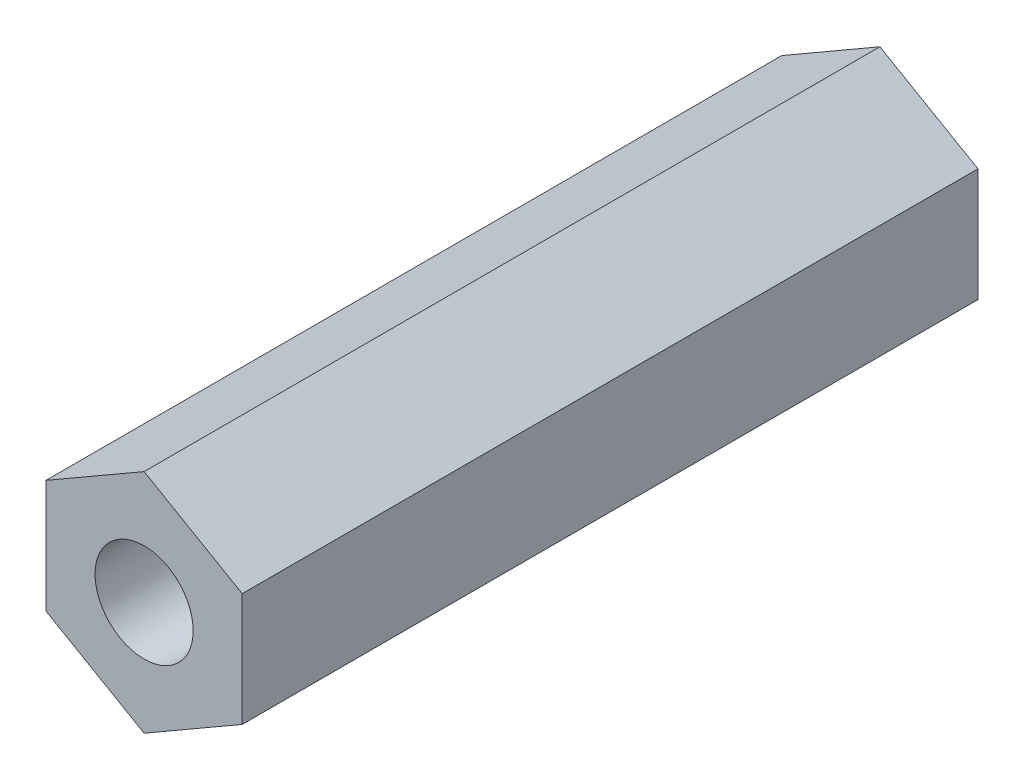
ISO-10303-21;
HEADER;
FILE_DESCRIPTION(('STEP AP214'),'2;1');
FILE_NAME('part.step','',(''),(''),'','','');
FILE_SCHEMA(('AUTOMOTIVE_DESIGN { 1 0 10303 214 1 1 1 1 }'));
ENDSEC;
DATA;
#1=APPLICATION_CONTEXT('core data for automotive mechanical design processes');
#2=APPLICATION_PROTOCOL_DEFINITION('international standard','automotive_design',2000,#1);
#3=PRODUCT_CONTEXT('',#1,'mechanical');
#4=PRODUCT('Part','Part','',(#3));
#5=PRODUCT_RELATED_PRODUCT_CATEGORY('part','',(#4));
#6=PRODUCT_DEFINITION_FORMATION('','',#4);
#7=PRODUCT_DEFINITION_CONTEXT('part definition',#1,'design');
#8=PRODUCT_DEFINITION('design','',#6,#7);
#9=PRODUCT_DEFINITION_SHAPE('','',#8);
#10=(LENGTH_UNIT() NAMED_UNIT(*) SI_UNIT(.MILLI.,.METRE.));
#11=(NAMED_UNIT(*) PLANE_ANGLE_UNIT() SI_UNIT($,.RADIAN.));
#12=(NAMED_UNIT(*) SI_UNIT($,.STERADIAN.) SOLID_ANGLE_UNIT());
#13=UNCERTAINTY_MEASURE_WITH_UNIT(LENGTH_MEASURE(1.E-05),#10,'distance_accuracy_value','');
#14=(GEOMETRIC_REPRESENTATION_CONTEXT(3) GLOBAL_UNCERTAINTY_ASSIGNED_CONTEXT((#13)) GLOBAL_UNIT_ASSIGNED_CONTEXT((#10,
#11,#12)) REPRESENTATION_CONTEXT('',''));
#15=CARTESIAN_POINT('',(0.,0.,0.));
#16=DIRECTION('',(0.,0.,1.));
#17=DIRECTION('',(1.,0.,0.));
#18=AXIS2_PLACEMENT_3D('',#15,#16,#17);
#19=CARTESIAN_POINT('',(0.,0.,30.));
#20=DIRECTION('',(0.,0.,1.));
#21=DIRECTION('',(1.,0.,0.));
#22=AXIS2_PLACEMENT_3D('',#19,#20,#21);
#23=PLANE('',#22);
#24=DIRECTION('',(0.866025403784438,0.5,0.));
#25=VECTOR('',#24,1.);
#26=CARTESIAN_POINT('',(0.,-4.61880215351701,30.));
#27=LINE('',#26,#25);
#28=CARTESIAN_POINT('',(0.,-4.61880215351701,30.));
#29=VERTEX_POINT('',#28);
#30=CARTESIAN_POINT('',(4.,-2.3094010767585,30.));
#31=VERTEX_POINT('',#30);
#32=EDGE_CURVE('E129',#29,#31,#27,.T.);
#33=ORIENTED_EDGE('',*,*,#32,.T.);
#34=DIRECTION('',(0.,1.,0.));
#35=VECTOR('',#34,1.);
#36=CARTESIAN_POINT('',(4.,-2.3094010767585,30.));
#37=LINE('',#36,#35);
#38=CARTESIAN_POINT('',(4.,2.3094010767585,30.));
#39=VERTEX_POINT('',#38);
#40=EDGE_CURVE('E87',#31,#39,#37,.T.);
#41=ORIENTED_EDGE('',*,*,#40,.T.);
#42=DIRECTION('',(-0.866025403784439,0.5,0.));
#43=VECTOR('',#42,1.);
#44=CARTESIAN_POINT('',(4.,2.3094010767585,30.));
#45=LINE('',#44,#43);
#46=CARTESIAN_POINT('',(0.,4.61880215351701,30.));
#47=VERTEX_POINT('',#46);
#48=EDGE_CURVE('E100',#39,#47,#45,.T.);
#49=ORIENTED_EDGE('',*,*,#48,.T.);
#50=DIRECTION('',(-0.866025403784439,-0.5,0.));
#51=VECTOR('',#50,1.);
#52=CARTESIAN_POINT('',(0.,4.61880215351701,30.));
#53=LINE('',#52,#51);
#54=CARTESIAN_POINT('',(-4.,2.3094010767585,30.));
#55=VERTEX_POINT('',#54);
#56=EDGE_CURVE('E94',#47,#55,#53,.T.);
#57=ORIENTED_EDGE('',*,*,#56,.T.);
#58=DIRECTION('',(0.,-1.,0.));
#59=VECTOR('',#58,1.);
#60=CARTESIAN_POINT('',(-4.,2.3094010767585,30.));
#61=LINE('',#60,#59);
#62=CARTESIAN_POINT('',(-4.,-2.3094010767585,30.));
#63=VERTEX_POINT('',#62);
#64=EDGE_CURVE('E98',#55,#63,#61,.T.);
#65=ORIENTED_EDGE('',*,*,#64,.T.);
#66=DIRECTION('',(0.866025403784438,-0.5,0.));
#67=VECTOR('',#66,1.);
#68=CARTESIAN_POINT('',(-4.,-2.3094010767585,30.));
#69=LINE('',#68,#67);
#70=EDGE_CURVE('E50',#63,#29,#69,.T.);
#71=ORIENTED_EDGE('',*,*,#70,.T.);
#72=EDGE_LOOP('',(#33,#41,#49,#57,#65,#71));
#73=FACE_BOUND('',#72,.T.);
#74=CARTESIAN_POINT('',(0.,0.,30.));
#75=DIRECTION('',(0.,0.,1.));
#76=DIRECTION('',(1.,0.,0.));
#77=AXIS2_PLACEMENT_3D('',#74,#75,#76);
#78=CIRCLE('',#77,2.);
#79=CARTESIAN_POINT('',(2.,0.,30.));
#80=VERTEX_POINT('',#79);
#81=EDGE_CURVE('E122',#80,#80,#78,.T.);
#82=ORIENTED_EDGE('',*,*,#81,.F.);
#83=EDGE_LOOP('',(#82));
#84=FACE_BOUND('',#83,.T.);
#85=ADVANCED_FACE('F33',(#73,#84),#23,.T.);
#86=CARTESIAN_POINT('',(0.,0.,0.));
#87=DIRECTION('',(0.,0.,1.));
#88=DIRECTION('',(1.,0.,0.));
#89=AXIS2_PLACEMENT_3D('',#86,#87,#88);
#90=PLANE('',#89);
#91=DIRECTION('',(0.866025403784438,0.5,0.));
#92=VECTOR('',#91,1.);
#93=CARTESIAN_POINT('',(0.,-4.61880215351701,0.));
#94=LINE('',#93,#92);
#95=CARTESIAN_POINT('',(0.,-4.61880215351701,0.));
#96=VERTEX_POINT('',#95);
#97=CARTESIAN_POINT('',(4.,-2.3094010767585,0.));
#98=VERTEX_POINT('',#97);
#99=EDGE_CURVE('E118',#96,#98,#94,.T.);
#100=ORIENTED_EDGE('',*,*,#99,.F.);
#101=DIRECTION('',(0.866025403784438,-0.5,0.));
#102=VECTOR('',#101,1.);
#103=CARTESIAN_POINT('',(-4.,-2.3094010767585,0.));
#104=LINE('',#103,#102);
#105=CARTESIAN_POINT('',(-4.,-2.3094010767585,0.));
#106=VERTEX_POINT('',#105);
#107=EDGE_CURVE('E79',#106,#96,#104,.T.);
#108=ORIENTED_EDGE('',*,*,#107,.F.);
#109=DIRECTION('',(0.,-1.,0.));
#110=VECTOR('',#109,1.);
#111=CARTESIAN_POINT('',(-4.,2.3094010767585,0.));
#112=LINE('',#111,#110);
#113=CARTESIAN_POINT('',(-4.,2.3094010767585,0.));
#114=VERTEX_POINT('',#113);
#115=EDGE_CURVE('E73',#114,#106,#112,.T.);
#116=ORIENTED_EDGE('',*,*,#115,.F.);
#117=DIRECTION('',(-0.866025403784439,-0.5,0.));
#118=VECTOR('',#117,1.);
#119=CARTESIAN_POINT('',(0.,4.61880215351701,0.));
#120=LINE('',#119,#118);
#121=CARTESIAN_POINT('',(0.,4.61880215351701,0.));
#122=VERTEX_POINT('',#121);
#123=EDGE_CURVE('E108',#122,#114,#120,.T.);
#124=ORIENTED_EDGE('',*,*,#123,.F.);
#125=DIRECTION('',(-0.866025403784439,0.5,0.));
#126=VECTOR('',#125,1.);
#127=CARTESIAN_POINT('',(4.,2.3094010767585,0.));
#128=LINE('',#127,#126);
#129=CARTESIAN_POINT('',(4.,2.3094010767585,0.));
#130=VERTEX_POINT('',#129);
#131=EDGE_CURVE('E124',#130,#122,#128,.T.);
#132=ORIENTED_EDGE('',*,*,#131,.F.);
#133=DIRECTION('',(0.,1.,0.));
#134=VECTOR('',#133,1.);
#135=CARTESIAN_POINT('',(4.,-2.3094010767585,0.));
#136=LINE('',#135,#134);
#137=EDGE_CURVE('E121',#98,#130,#136,.T.);
#138=ORIENTED_EDGE('',*,*,#137,.F.);
#139=EDGE_LOOP('',(#100,#108,#116,#124,#132,#138));
#140=FACE_BOUND('',#139,.T.);
#141=CARTESIAN_POINT('',(0.,0.,0.));
#142=DIRECTION('',(0.,0.,1.));
#143=DIRECTION('',(1.,0.,0.));
#144=AXIS2_PLACEMENT_3D('',#141,#142,#143);
#145=CIRCLE('',#144,2.);
#146=CARTESIAN_POINT('',(2.,0.,0.));
#147=VERTEX_POINT('',#146);
#148=EDGE_CURVE('E222',#147,#147,#145,.T.);
#149=ORIENTED_EDGE('',*,*,#148,.T.);
#150=EDGE_LOOP('',(#149));
#151=FACE_BOUND('',#150,.T.);
#152=ADVANCED_FACE('F138',(#140,#151),#90,.F.);
#153=CARTESIAN_POINT('',(0.,-4.61880215351701,30.));
#154=DIRECTION('',(-0.5,0.866025403784438,0.));
#155=DIRECTION('',(-0.866025403784439,-0.5,0.));
#156=AXIS2_PLACEMENT_3D('',#153,#154,#155);
#157=PLANE('',#156);
#158=ORIENTED_EDGE('',*,*,#99,.T.);
#159=DIRECTION('',(0.,0.,-1.));
#160=VECTOR('',#159,1.);
#161=CARTESIAN_POINT('',(4.,-2.3094010767585,30.));
#162=LINE('',#161,#160);
#163=EDGE_CURVE('E11',#31,#98,#162,.T.);
#164=ORIENTED_EDGE('',*,*,#163,.F.);
#165=ORIENTED_EDGE('',*,*,#32,.F.);
#166=DIRECTION('',(0.,0.,-1.));
#167=VECTOR('',#166,1.);
#168=CARTESIAN_POINT('',(0.,-4.61880215351701,30.));
#169=LINE('',#168,#167);
#170=EDGE_CURVE('E114',#29,#96,#169,.T.);
#171=ORIENTED_EDGE('',*,*,#170,.T.);
#172=EDGE_LOOP('',(#158,#164,#165,#171));
#173=FACE_BOUND('',#172,.T.);
#174=ADVANCED_FACE('F35',(#173),#157,.F.);
#175=CARTESIAN_POINT('',(4.,-2.3094010767585,30.));
#176=DIRECTION('',(-1.,0.,0.));
#177=DIRECTION('',(0.,0.,1.));
#178=AXIS2_PLACEMENT_3D('',#175,#176,#177);
#179=PLANE('',#178);
#180=ORIENTED_EDGE('',*,*,#137,.T.);
#181=DIRECTION('',(0.,0.,-1.));
#182=VECTOR('',#181,1.);
#183=CARTESIAN_POINT('',(4.,2.3094010767585,30.));
#184=LINE('',#183,#182);
#185=EDGE_CURVE('E42',#39,#130,#184,.T.);
#186=ORIENTED_EDGE('',*,*,#185,.F.);
#187=ORIENTED_EDGE('',*,*,#40,.F.);
#188=ORIENTED_EDGE('',*,*,#163,.T.);
#189=EDGE_LOOP('',(#180,#186,#187,#188));
#190=FACE_BOUND('',#189,.T.);
#191=ADVANCED_FACE('F163',(#190),#179,.F.);
#192=CARTESIAN_POINT('',(4.,2.3094010767585,30.));
#193=DIRECTION('',(-0.5,-0.866025403784439,0.));
#194=DIRECTION('',(0.866025403784439,-0.5,0.));
#195=AXIS2_PLACEMENT_3D('',#192,#193,#194);
#196=PLANE('',#195);
#197=ORIENTED_EDGE('',*,*,#131,.T.);
#198=DIRECTION('',(0.,0.,-1.));
#199=VECTOR('',#198,1.);
#200=CARTESIAN_POINT('',(0.,4.61880215351701,30.));
#201=LINE('',#200,#199);
#202=EDGE_CURVE('E109',#47,#122,#201,.T.);
#203=ORIENTED_EDGE('',*,*,#202,.F.);
#204=ORIENTED_EDGE('',*,*,#48,.F.);
#205=ORIENTED_EDGE('',*,*,#185,.T.);
#206=EDGE_LOOP('',(#197,#203,#204,#205));
#207=FACE_BOUND('',#206,.T.);
#208=ADVANCED_FACE('F135',(#207),#196,.F.);
#209=CARTESIAN_POINT('',(0.,4.61880215351701,30.));
#210=DIRECTION('',(0.5,-0.866025403784438,0.));
#211=DIRECTION('',(0.866025403784439,0.5,0.));
#212=AXIS2_PLACEMENT_3D('',#209,#210,#211);
#213=PLANE('',#212);
#214=ORIENTED_EDGE('',*,*,#123,.T.);
#215=DIRECTION('',(0.,0.,-1.));
#216=VECTOR('',#215,1.);
#217=CARTESIAN_POINT('',(-4.,2.3094010767585,30.));
#218=LINE('',#217,#216);
#219=EDGE_CURVE('E105',#55,#114,#218,.T.);
#220=ORIENTED_EDGE('',*,*,#219,.F.);
#221=ORIENTED_EDGE('',*,*,#56,.F.);
#222=ORIENTED_EDGE('',*,*,#202,.T.);
#223=EDGE_LOOP('',(#214,#220,#221,#222));
#224=FACE_BOUND('',#223,.T.);
#225=ADVANCED_FACE('F106',(#224),#213,.F.);
#226=CARTESIAN_POINT('',(-4.,2.3094010767585,30.));
#227=DIRECTION('',(1.,0.,0.));
#228=DIRECTION('',(0.,1.,0.));
#229=AXIS2_PLACEMENT_3D('',#226,#227,#228);
#230=PLANE('',#229);
#231=ORIENTED_EDGE('',*,*,#115,.T.);
#232=DIRECTION('',(0.,0.,-1.));
#233=VECTOR('',#232,1.);
#234=CARTESIAN_POINT('',(-4.,-2.3094010767585,30.));
#235=LINE('',#234,#233);
#236=EDGE_CURVE('E110',#63,#106,#235,.T.);
#237=ORIENTED_EDGE('',*,*,#236,.F.);
#238=ORIENTED_EDGE('',*,*,#64,.F.);
#239=ORIENTED_EDGE('',*,*,#219,.T.);
#240=EDGE_LOOP('',(#231,#237,#238,#239));
#241=FACE_BOUND('',#240,.T.);
#242=ADVANCED_FACE('F112',(#241),#230,.F.);
#243=CARTESIAN_POINT('',(-4.,-2.3094010767585,30.));
#244=DIRECTION('',(0.5,0.866025403784438,0.));
#245=DIRECTION('',(-0.866025403784439,0.5,0.));
#246=AXIS2_PLACEMENT_3D('',#243,#244,#245);
#247=PLANE('',#246);
#248=ORIENTED_EDGE('',*,*,#107,.T.);
#249=ORIENTED_EDGE('',*,*,#170,.F.);
#250=ORIENTED_EDGE('',*,*,#70,.F.);
#251=ORIENTED_EDGE('',*,*,#236,.T.);
#252=EDGE_LOOP('',(#248,#249,#250,#251));
#253=FACE_BOUND('',#252,.T.);
#254=ADVANCED_FACE('F143',(#253),#247,.F.);
#255=CARTESIAN_POINT('',(0.,0.,30.));
#256=DIRECTION('',(0.,0.,-1.));
#257=DIRECTION('',(-1.,0.,0.));
#258=AXIS2_PLACEMENT_3D('',#255,#256,#257);
#259=CYLINDRICAL_SURFACE('',#258,2.);
#260=ORIENTED_EDGE('',*,*,#81,.T.);
#261=EDGE_LOOP('',(#260));
#262=FACE_BOUND('',#261,.T.);
#263=ORIENTED_EDGE('',*,*,#148,.F.);
#264=EDGE_LOOP('',(#263));
#265=FACE_BOUND('',#264,.T.);
#266=ADVANCED_FACE('F145',(#262,#265),#259,.F.);
#267=CLOSED_SHELL('',(#85,#152,#174,#191,#208,#225,#242,#254,#266));
#268=MANIFOLD_SOLID_BREP('B2',#267);
#269=ADVANCED_BREP_SHAPE_REPRESENTATION('',(#18,#268),#14);
#270=SHAPE_DEFINITION_REPRESENTATION(#9,#269);
ENDSEC;
END-ISO-10303-21;
